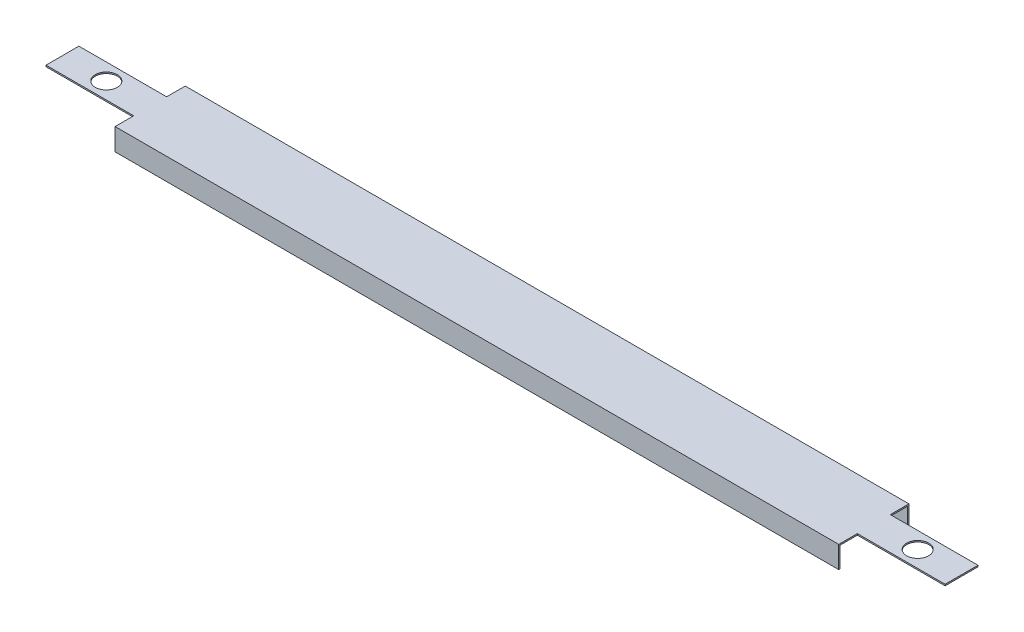
ISO-10303-21;
HEADER;
FILE_DESCRIPTION(('STEP AP214'),'2;1');
FILE_NAME('part.step','',(''),(''),'','','');
FILE_SCHEMA(('AUTOMOTIVE_DESIGN { 1 0 10303 214 1 1 1 1 }'));
ENDSEC;
DATA;
#1=APPLICATION_CONTEXT('core data for automotive mechanical design processes');
#2=APPLICATION_PROTOCOL_DEFINITION('international standard','automotive_design',2000,#1);
#3=PRODUCT_CONTEXT('',#1,'mechanical');
#4=PRODUCT('Part','Part','',(#3));
#5=PRODUCT_RELATED_PRODUCT_CATEGORY('part','',(#4));
#6=PRODUCT_DEFINITION_FORMATION('','',#4);
#7=PRODUCT_DEFINITION_CONTEXT('part definition',#1,'design');
#8=PRODUCT_DEFINITION('design','',#6,#7);
#9=PRODUCT_DEFINITION_SHAPE('','',#8);
#10=(LENGTH_UNIT() NAMED_UNIT(*) SI_UNIT(.MILLI.,.METRE.));
#11=(NAMED_UNIT(*) PLANE_ANGLE_UNIT() SI_UNIT($,.RADIAN.));
#12=(NAMED_UNIT(*) SI_UNIT($,.STERADIAN.) SOLID_ANGLE_UNIT());
#13=UNCERTAINTY_MEASURE_WITH_UNIT(LENGTH_MEASURE(1.E-05),#10,'distance_accuracy_value','');
#14=(GEOMETRIC_REPRESENTATION_CONTEXT(3) GLOBAL_UNCERTAINTY_ASSIGNED_CONTEXT((#13)) GLOBAL_UNIT_ASSIGNED_CONTEXT((#10,
#11,#12)) REPRESENTATION_CONTEXT('',''));
#15=CARTESIAN_POINT('',(0.,0.,0.));
#16=DIRECTION('',(0.,0.,1.));
#17=DIRECTION('',(1.,0.,0.));
#18=AXIS2_PLACEMENT_3D('',#15,#16,#17);
#19=CARTESIAN_POINT('',(0.,-6.35,0.));
#20=DIRECTION('',(0.,-1.,0.));
#21=DIRECTION('',(0.,0.,-1.));
#22=AXIS2_PLACEMENT_3D('',#19,#20,#21);
#23=PLANE('',#22);
#24=DIRECTION('',(0.,0.,1.));
#25=VECTOR('',#24,1.);
#26=CARTESIAN_POINT('',(104.775,-6.35,-10.16));
#27=LINE('',#26,#25);
#28=CARTESIAN_POINT('',(104.775,-6.35,-10.16));
#29=VERTEX_POINT('',#28);
#30=CARTESIAN_POINT('',(104.775,-6.35,-9.7536));
#31=VERTEX_POINT('',#30);
#32=EDGE_CURVE('E280',#29,#31,#27,.T.);
#33=ORIENTED_EDGE('',*,*,#32,.T.);
#34=DIRECTION('',(1.,0.,0.));
#35=VECTOR('',#34,1.);
#36=CARTESIAN_POINT('',(-130.175,-6.35,-9.7536));
#37=LINE('',#36,#35);
#38=CARTESIAN_POINT('',(-104.775,-6.35,-9.7536));
#39=VERTEX_POINT('',#38);
#40=EDGE_CURVE('E234',#39,#31,#37,.T.);
#41=ORIENTED_EDGE('',*,*,#40,.F.);
#42=DIRECTION('',(0.,0.,-1.));
#43=VECTOR('',#42,1.);
#44=CARTESIAN_POINT('',(-104.775,-6.35,-10.16));
#45=LINE('',#44,#43);
#46=CARTESIAN_POINT('',(-104.775,-6.35,-10.16));
#47=VERTEX_POINT('',#46);
#48=EDGE_CURVE('E48',#39,#47,#45,.T.);
#49=ORIENTED_EDGE('',*,*,#48,.T.);
#50=DIRECTION('',(-1.,0.,0.));
#51=VECTOR('',#50,1.);
#52=CARTESIAN_POINT('',(-130.175,-6.35,-10.16));
#53=LINE('',#52,#51);
#54=EDGE_CURVE('E174',#29,#47,#53,.T.);
#55=ORIENTED_EDGE('',*,*,#54,.F.);
#56=EDGE_LOOP('',(#33,#41,#49,#55));
#57=FACE_BOUND('',#56,.T.);
#58=ADVANCED_FACE('F33',(#57),#23,.T.);
#59=CARTESIAN_POINT('',(130.175,-6.35,10.16));
#60=DIRECTION('',(1.,0.,0.));
#61=DIRECTION('',(0.,0.,-1.));
#62=AXIS2_PLACEMENT_3D('',#59,#60,#61);
#63=PLANE('',#62);
#64=DIRECTION('',(0.,1.,0.));
#65=VECTOR('',#64,1.);
#66=CARTESIAN_POINT('',(130.175,-6.35,-4.7625));
#67=LINE('',#66,#65);
#68=CARTESIAN_POINT('',(130.175,-0.4064,-4.7625));
#69=VERTEX_POINT('',#68);
#70=CARTESIAN_POINT('',(130.175,0.,-4.7625));
#71=VERTEX_POINT('',#70);
#72=EDGE_CURVE('E224',#69,#71,#67,.T.);
#73=ORIENTED_EDGE('',*,*,#72,.T.);
#74=DIRECTION('',(0.,0.,-1.));
#75=VECTOR('',#74,1.);
#76=CARTESIAN_POINT('',(130.175,0.,10.16));
#77=LINE('',#76,#75);
#78=CARTESIAN_POINT('',(130.175,0.,4.7625));
#79=VERTEX_POINT('',#78);
#80=EDGE_CURVE('E183',#79,#71,#77,.T.);
#81=ORIENTED_EDGE('',*,*,#80,.F.);
#82=DIRECTION('',(0.,1.,0.));
#83=VECTOR('',#82,1.);
#84=CARTESIAN_POINT('',(130.175,-6.35,4.7625));
#85=LINE('',#84,#83);
#86=CARTESIAN_POINT('',(130.175,-0.4064,4.7625));
#87=VERTEX_POINT('',#86);
#88=EDGE_CURVE('E168',#87,#79,#85,.T.);
#89=ORIENTED_EDGE('',*,*,#88,.F.);
#90=DIRECTION('',(0.,0.,1.));
#91=VECTOR('',#90,1.);
#92=CARTESIAN_POINT('',(130.175,-0.4064,9.7536));
#93=LINE('',#92,#91);
#94=EDGE_CURVE('E217',#69,#87,#93,.T.);
#95=ORIENTED_EDGE('',*,*,#94,.F.);
#96=EDGE_LOOP('',(#73,#81,#89,#95));
#97=FACE_BOUND('',#96,.T.);
#98=ADVANCED_FACE('F35',(#97),#63,.T.);
#99=CARTESIAN_POINT('',(-130.175,-6.35,10.16));
#100=DIRECTION('',(0.,0.,1.));
#101=DIRECTION('',(1.,0.,0.));
#102=AXIS2_PLACEMENT_3D('',#99,#100,#101);
#103=PLANE('',#102);
#104=DIRECTION('',(0.,1.,0.));
#105=VECTOR('',#104,1.);
#106=CARTESIAN_POINT('',(-104.775,-6.35,10.16));
#107=LINE('',#106,#105);
#108=CARTESIAN_POINT('',(-104.775,-6.35,10.16));
#109=VERTEX_POINT('',#108);
#110=CARTESIAN_POINT('',(-104.775,0.,10.16));
#111=VERTEX_POINT('',#110);
#112=EDGE_CURVE('E172',#109,#111,#107,.T.);
#113=ORIENTED_EDGE('',*,*,#112,.F.);
#114=DIRECTION('',(1.,0.,0.));
#115=VECTOR('',#114,1.);
#116=CARTESIAN_POINT('',(-130.175,-6.35,10.16));
#117=LINE('',#116,#115);
#118=CARTESIAN_POINT('',(104.775,-6.35,10.16));
#119=VERTEX_POINT('',#118);
#120=EDGE_CURVE('E165',#109,#119,#117,.T.);
#121=ORIENTED_EDGE('',*,*,#120,.T.);
#122=DIRECTION('',(0.,1.,0.));
#123=VECTOR('',#122,1.);
#124=CARTESIAN_POINT('',(104.775,-6.35,10.16));
#125=LINE('',#124,#123);
#126=CARTESIAN_POINT('',(104.775,0.,10.16));
#127=VERTEX_POINT('',#126);
#128=EDGE_CURVE('E146',#119,#127,#125,.T.);
#129=ORIENTED_EDGE('',*,*,#128,.T.);
#130=DIRECTION('',(1.,0.,0.));
#131=VECTOR('',#130,1.);
#132=CARTESIAN_POINT('',(-130.175,0.,10.16));
#133=LINE('',#132,#131);
#134=EDGE_CURVE('E179',#111,#127,#133,.T.);
#135=ORIENTED_EDGE('',*,*,#134,.F.);
#136=EDGE_LOOP('',(#113,#121,#129,#135));
#137=FACE_BOUND('',#136,.T.);
#138=ADVANCED_FACE('F171',(#137),#103,.T.);
#139=CARTESIAN_POINT('',(-130.175,-6.35,10.16));
#140=DIRECTION('',(-1.,0.,0.));
#141=DIRECTION('',(0.,0.,1.));
#142=AXIS2_PLACEMENT_3D('',#139,#140,#141);
#143=PLANE('',#142);
#144=DIRECTION('',(0.,1.,0.));
#145=VECTOR('',#144,1.);
#146=CARTESIAN_POINT('',(-130.175,-6.35,4.7625));
#147=LINE('',#146,#145);
#148=CARTESIAN_POINT('',(-130.175,-0.4064,4.7625));
#149=VERTEX_POINT('',#148);
#150=CARTESIAN_POINT('',(-130.175,0.,4.7625));
#151=VERTEX_POINT('',#150);
#152=EDGE_CURVE('E268',#149,#151,#147,.T.);
#153=ORIENTED_EDGE('',*,*,#152,.T.);
#154=DIRECTION('',(0.,0.,1.));
#155=VECTOR('',#154,1.);
#156=CARTESIAN_POINT('',(-130.175,0.,10.16));
#157=LINE('',#156,#155);
#158=CARTESIAN_POINT('',(-130.175,0.,-4.7625));
#159=VERTEX_POINT('',#158);
#160=EDGE_CURVE('E190',#159,#151,#157,.T.);
#161=ORIENTED_EDGE('',*,*,#160,.F.);
#162=DIRECTION('',(0.,1.,0.));
#163=VECTOR('',#162,1.);
#164=CARTESIAN_POINT('',(-130.175,-6.35,-4.7625));
#165=LINE('',#164,#163);
#166=CARTESIAN_POINT('',(-130.175,-0.4064,-4.7625));
#167=VERTEX_POINT('',#166);
#168=EDGE_CURVE('E266',#167,#159,#165,.T.);
#169=ORIENTED_EDGE('',*,*,#168,.F.);
#170=DIRECTION('',(0.,0.,1.));
#171=VECTOR('',#170,1.);
#172=CARTESIAN_POINT('',(-130.175,-0.4064,9.7536));
#173=LINE('',#172,#171);
#174=EDGE_CURVE('E225',#167,#149,#173,.T.);
#175=ORIENTED_EDGE('',*,*,#174,.T.);
#176=EDGE_LOOP('',(#153,#161,#169,#175));
#177=FACE_BOUND('',#176,.T.);
#178=ADVANCED_FACE('F265',(#177),#143,.T.);
#179=CARTESIAN_POINT('',(-130.175,-6.35,-10.16));
#180=DIRECTION('',(0.,0.,-1.));
#181=DIRECTION('',(-1.,0.,0.));
#182=AXIS2_PLACEMENT_3D('',#179,#180,#181);
#183=PLANE('',#182);
#184=DIRECTION('',(0.,1.,0.));
#185=VECTOR('',#184,1.);
#186=CARTESIAN_POINT('',(104.775,-6.35,-10.16));
#187=LINE('',#186,#185);
#188=CARTESIAN_POINT('',(104.775,0.,-10.16));
#189=VERTEX_POINT('',#188);
#190=EDGE_CURVE('E283',#29,#189,#187,.T.);
#191=ORIENTED_EDGE('',*,*,#190,.F.);
#192=ORIENTED_EDGE('',*,*,#54,.T.);
#193=DIRECTION('',(0.,1.,0.));
#194=VECTOR('',#193,1.);
#195=CARTESIAN_POINT('',(-104.775,-6.35,-10.16));
#196=LINE('',#195,#194);
#197=CARTESIAN_POINT('',(-104.775,0.,-10.16));
#198=VERTEX_POINT('',#197);
#199=EDGE_CURVE('E295',#47,#198,#196,.T.);
#200=ORIENTED_EDGE('',*,*,#199,.T.);
#201=DIRECTION('',(-1.,0.,0.));
#202=VECTOR('',#201,1.);
#203=CARTESIAN_POINT('',(-130.175,0.,-10.16));
#204=LINE('',#203,#202);
#205=EDGE_CURVE('E186',#189,#198,#204,.T.);
#206=ORIENTED_EDGE('',*,*,#205,.F.);
#207=EDGE_LOOP('',(#191,#192,#200,#206));
#208=FACE_BOUND('',#207,.T.);
#209=ADVANCED_FACE('F317',(#208),#183,.T.);
#210=DIRECTION('',(0.,0.,-1.));
#211=VECTOR('',#210,1.);
#212=CARTESIAN_POINT('',(-104.775,-6.35,10.16));
#213=LINE('',#212,#211);
#214=CARTESIAN_POINT('',(-104.775,-6.35,9.7536));
#215=VERTEX_POINT('',#214);
#216=EDGE_CURVE('E279',#109,#215,#213,.T.);
#217=ORIENTED_EDGE('',*,*,#216,.T.);
#218=DIRECTION('',(1.,0.,0.));
#219=VECTOR('',#218,1.);
#220=CARTESIAN_POINT('',(-130.175,-6.35,9.7536));
#221=LINE('',#220,#219);
#222=CARTESIAN_POINT('',(104.775,-6.35,9.7536));
#223=VERTEX_POINT('',#222);
#224=EDGE_CURVE('E167',#215,#223,#221,.T.);
#225=ORIENTED_EDGE('',*,*,#224,.T.);
#226=DIRECTION('',(0.,0.,1.));
#227=VECTOR('',#226,1.);
#228=CARTESIAN_POINT('',(104.775,-6.35,10.16));
#229=LINE('',#228,#227);
#230=EDGE_CURVE('E149',#223,#119,#229,.T.);
#231=ORIENTED_EDGE('',*,*,#230,.T.);
#232=ORIENTED_EDGE('',*,*,#120,.F.);
#233=EDGE_LOOP('',(#217,#225,#231,#232));
#234=FACE_BOUND('',#233,.T.);
#235=ADVANCED_FACE('F164',(#234),#23,.T.);
#236=CARTESIAN_POINT('',(0.,0.,0.));
#237=DIRECTION('',(0.,-1.,0.));
#238=DIRECTION('',(0.,0.,-1.));
#239=AXIS2_PLACEMENT_3D('',#236,#237,#238);
#240=PLANE('',#239);
#241=CARTESIAN_POINT('',(117.475,0.,0.));
#242=DIRECTION('',(0.,1.,0.));
#243=DIRECTION('',(0.,0.,1.));
#244=AXIS2_PLACEMENT_3D('',#241,#242,#243);
#245=CIRCLE('',#244,3.1877);
#246=CARTESIAN_POINT('',(117.475,0.,3.18769999999997));
#247=VERTEX_POINT('',#246);
#248=EDGE_CURVE('E242',#247,#247,#245,.T.);
#249=ORIENTED_EDGE('',*,*,#248,.F.);
#250=EDGE_LOOP('',(#249));
#251=FACE_BOUND('',#250,.T.);
#252=CARTESIAN_POINT('',(-117.475,0.,0.));
#253=DIRECTION('',(0.,1.,0.));
#254=DIRECTION('',(0.,0.,1.));
#255=AXIS2_PLACEMENT_3D('',#252,#253,#254);
#256=CIRCLE('',#255,3.1877);
#257=CARTESIAN_POINT('',(-117.475,0.,3.1877));
#258=VERTEX_POINT('',#257);
#259=EDGE_CURVE('E187',#258,#258,#256,.T.);
#260=ORIENTED_EDGE('',*,*,#259,.F.);
#261=EDGE_LOOP('',(#260));
#262=FACE_BOUND('',#261,.T.);
#263=ORIENTED_EDGE('',*,*,#160,.T.);
#264=DIRECTION('',(-1.,0.,0.));
#265=VECTOR('',#264,1.);
#266=CARTESIAN_POINT('',(-130.175,0.,4.7625));
#267=LINE('',#266,#265);
#268=CARTESIAN_POINT('',(-104.775,0.,4.7625));
#269=VERTEX_POINT('',#268);
#270=EDGE_CURVE('E258',#269,#151,#267,.T.);
#271=ORIENTED_EDGE('',*,*,#270,.F.);
#272=DIRECTION('',(0.,0.,-1.));
#273=VECTOR('',#272,1.);
#274=CARTESIAN_POINT('',(-104.775,0.,10.16));
#275=LINE('',#274,#273);
#276=EDGE_CURVE('E289',#111,#269,#275,.T.);
#277=ORIENTED_EDGE('',*,*,#276,.F.);
#278=ORIENTED_EDGE('',*,*,#134,.T.);
#279=DIRECTION('',(0.,0.,1.));
#280=VECTOR('',#279,1.);
#281=CARTESIAN_POINT('',(104.775,0.,10.16));
#282=LINE('',#281,#280);
#283=CARTESIAN_POINT('',(104.775,0.,4.7625));
#284=VERTEX_POINT('',#283);
#285=EDGE_CURVE('E152',#284,#127,#282,.T.);
#286=ORIENTED_EDGE('',*,*,#285,.F.);
#287=DIRECTION('',(-1.,0.,0.));
#288=VECTOR('',#287,1.);
#289=CARTESIAN_POINT('',(130.175,0.,4.7625));
#290=LINE('',#289,#288);
#291=EDGE_CURVE('E501',#79,#284,#290,.T.);
#292=ORIENTED_EDGE('',*,*,#291,.F.);
#293=ORIENTED_EDGE('',*,*,#80,.T.);
#294=DIRECTION('',(1.,0.,0.));
#295=VECTOR('',#294,1.);
#296=CARTESIAN_POINT('',(130.175,0.,-4.7625));
#297=LINE('',#296,#295);
#298=CARTESIAN_POINT('',(104.775,0.,-4.7625));
#299=VERTEX_POINT('',#298);
#300=EDGE_CURVE('E284',#299,#71,#297,.T.);
#301=ORIENTED_EDGE('',*,*,#300,.F.);
#302=DIRECTION('',(0.,0.,1.));
#303=VECTOR('',#302,1.);
#304=CARTESIAN_POINT('',(104.775,0.,-10.16));
#305=LINE('',#304,#303);
#306=EDGE_CURVE('E157',#189,#299,#305,.T.);
#307=ORIENTED_EDGE('',*,*,#306,.F.);
#308=ORIENTED_EDGE('',*,*,#205,.T.);
#309=DIRECTION('',(0.,0.,-1.));
#310=VECTOR('',#309,1.);
#311=CARTESIAN_POINT('',(-104.775,0.,-10.16));
#312=LINE('',#311,#310);
#313=CARTESIAN_POINT('',(-104.775,0.,-4.7625));
#314=VERTEX_POINT('',#313);
#315=EDGE_CURVE('E272',#314,#198,#312,.T.);
#316=ORIENTED_EDGE('',*,*,#315,.F.);
#317=DIRECTION('',(1.,0.,0.));
#318=VECTOR('',#317,1.);
#319=CARTESIAN_POINT('',(-130.175,0.,-4.7625));
#320=LINE('',#319,#318);
#321=EDGE_CURVE('E261',#159,#314,#320,.T.);
#322=ORIENTED_EDGE('',*,*,#321,.F.);
#323=EDGE_LOOP('',(#263,#271,#277,#278,#286,#292,#293,#301,#307,#308,#316,#322));
#324=FACE_BOUND('',#323,.T.);
#325=ADVANCED_FACE('F249',(#251,#262,#324),#240,.F.);
#326=CARTESIAN_POINT('',(-117.475,-6.35,0.));
#327=DIRECTION('',(0.,1.,0.));
#328=DIRECTION('',(0.,0.,1.));
#329=AXIS2_PLACEMENT_3D('',#326,#327,#328);
#330=CYLINDRICAL_SURFACE('',#329,3.1877);
#331=CARTESIAN_POINT('',(-117.475,-0.4064,0.));
#332=DIRECTION('',(0.,1.,0.));
#333=DIRECTION('',(0.,0.,1.));
#334=AXIS2_PLACEMENT_3D('',#331,#332,#333);
#335=CIRCLE('',#334,3.1877);
#336=CARTESIAN_POINT('',(-117.475,-0.4064,3.1877));
#337=VERTEX_POINT('',#336);
#338=EDGE_CURVE('E196',#337,#337,#335,.F.);
#339=ORIENTED_EDGE('',*,*,#338,.T.);
#340=EDGE_LOOP('',(#339));
#341=FACE_BOUND('',#340,.T.);
#342=ORIENTED_EDGE('',*,*,#259,.T.);
#343=EDGE_LOOP('',(#342));
#344=FACE_BOUND('',#343,.T.);
#345=ADVANCED_FACE('F247',(#341,#344),#330,.F.);
#346=CARTESIAN_POINT('',(117.475,-6.35,0.));
#347=DIRECTION('',(0.,1.,0.));
#348=DIRECTION('',(0.,0.,1.));
#349=AXIS2_PLACEMENT_3D('',#346,#347,#348);
#350=CYLINDRICAL_SURFACE('',#349,3.1877);
#351=CARTESIAN_POINT('',(117.475,-0.4064,0.));
#352=DIRECTION('',(0.,1.,0.));
#353=DIRECTION('',(0.,0.,1.));
#354=AXIS2_PLACEMENT_3D('',#351,#352,#353);
#355=CIRCLE('',#354,3.1877);
#356=CARTESIAN_POINT('',(117.475,-0.4064,3.18769999999997));
#357=VERTEX_POINT('',#356);
#358=EDGE_CURVE('E194',#357,#357,#355,.F.);
#359=ORIENTED_EDGE('',*,*,#358,.T.);
#360=EDGE_LOOP('',(#359));
#361=FACE_BOUND('',#360,.T.);
#362=ORIENTED_EDGE('',*,*,#248,.T.);
#363=EDGE_LOOP('',(#362));
#364=FACE_BOUND('',#363,.T.);
#365=ADVANCED_FACE('F383',(#361,#364),#350,.F.);
#366=CARTESIAN_POINT('',(-130.175,-0.4064,9.7536));
#367=DIRECTION('',(0.,1.,0.));
#368=DIRECTION('',(0.,0.,1.));
#369=AXIS2_PLACEMENT_3D('',#366,#367,#368);
#370=PLANE('',#369);
#371=ORIENTED_EDGE('',*,*,#358,.F.);
#372=EDGE_LOOP('',(#371));
#373=FACE_BOUND('',#372,.T.);
#374=DIRECTION('',(0.,0.,-1.));
#375=VECTOR('',#374,1.);
#376=CARTESIAN_POINT('',(-104.775,-0.4064,9.7536));
#377=LINE('',#376,#375);
#378=CARTESIAN_POINT('',(-104.775,-0.4064,9.7536));
#379=VERTEX_POINT('',#378);
#380=CARTESIAN_POINT('',(-104.775,-0.4064,4.7625));
#381=VERTEX_POINT('',#380);
#382=EDGE_CURVE('E304',#379,#381,#377,.T.);
#383=ORIENTED_EDGE('',*,*,#382,.T.);
#384=DIRECTION('',(-1.,0.,0.));
#385=VECTOR('',#384,1.);
#386=CARTESIAN_POINT('',(-130.175,-0.4064,4.7625));
#387=LINE('',#386,#385);
#388=EDGE_CURVE('E11',#381,#149,#387,.T.);
#389=ORIENTED_EDGE('',*,*,#388,.T.);
#390=ORIENTED_EDGE('',*,*,#174,.F.);
#391=DIRECTION('',(1.,0.,0.));
#392=VECTOR('',#391,1.);
#393=CARTESIAN_POINT('',(-130.175,-0.4064,-4.7625));
#394=LINE('',#393,#392);
#395=CARTESIAN_POINT('',(-104.775,-0.4064,-4.7625));
#396=VERTEX_POINT('',#395);
#397=EDGE_CURVE('E205',#167,#396,#394,.T.);
#398=ORIENTED_EDGE('',*,*,#397,.T.);
#399=DIRECTION('',(0.,0.,-1.));
#400=VECTOR('',#399,1.);
#401=CARTESIAN_POINT('',(-104.775,-0.4064,9.7536));
#402=LINE('',#401,#400);
#403=CARTESIAN_POINT('',(-104.775,-0.4064,-9.7536));
#404=VERTEX_POINT('',#403);
#405=EDGE_CURVE('E230',#396,#404,#402,.T.);
#406=ORIENTED_EDGE('',*,*,#405,.T.);
#407=DIRECTION('',(1.,0.,0.));
#408=VECTOR('',#407,1.);
#409=CARTESIAN_POINT('',(-130.175,-0.4064,-9.7536));
#410=LINE('',#409,#408);
#411=CARTESIAN_POINT('',(104.775,-0.4064,-9.7536));
#412=VERTEX_POINT('',#411);
#413=EDGE_CURVE('E197',#404,#412,#410,.T.);
#414=ORIENTED_EDGE('',*,*,#413,.T.);
#415=DIRECTION('',(0.,0.,1.));
#416=VECTOR('',#415,1.);
#417=CARTESIAN_POINT('',(104.775,-0.4064,9.7536));
#418=LINE('',#417,#416);
#419=CARTESIAN_POINT('',(104.775,-0.4064,-4.7625));
#420=VERTEX_POINT('',#419);
#421=EDGE_CURVE('E56',#412,#420,#418,.T.);
#422=ORIENTED_EDGE('',*,*,#421,.T.);
#423=DIRECTION('',(1.,0.,0.));
#424=VECTOR('',#423,1.);
#425=CARTESIAN_POINT('',(-130.175,-0.4064,-4.76249999999999));
#426=LINE('',#425,#424);
#427=EDGE_CURVE('E41',#420,#69,#426,.T.);
#428=ORIENTED_EDGE('',*,*,#427,.T.);
#429=ORIENTED_EDGE('',*,*,#94,.T.);
#430=DIRECTION('',(-1.,0.,0.));
#431=VECTOR('',#430,1.);
#432=CARTESIAN_POINT('',(-130.175,-0.4064,4.76250000000001));
#433=LINE('',#432,#431);
#434=CARTESIAN_POINT('',(104.775,-0.4064,4.7625));
#435=VERTEX_POINT('',#434);
#436=EDGE_CURVE('E208',#87,#435,#433,.T.);
#437=ORIENTED_EDGE('',*,*,#436,.T.);
#438=DIRECTION('',(0.,0.,1.));
#439=VECTOR('',#438,1.);
#440=CARTESIAN_POINT('',(104.775,-0.4064,9.7536));
#441=LINE('',#440,#439);
#442=CARTESIAN_POINT('',(104.775,-0.406399999999999,9.7536));
#443=VERTEX_POINT('',#442);
#444=EDGE_CURVE('E298',#435,#443,#441,.T.);
#445=ORIENTED_EDGE('',*,*,#444,.T.);
#446=DIRECTION('',(1.,0.,0.));
#447=VECTOR('',#446,1.);
#448=CARTESIAN_POINT('',(-130.175,-0.4064,9.7536));
#449=LINE('',#448,#447);
#450=EDGE_CURVE('E228',#379,#443,#449,.T.);
#451=ORIENTED_EDGE('',*,*,#450,.F.);
#452=EDGE_LOOP('',(#383,#389,#390,#398,#406,#414,#422,#428,#429,#437,#445,#451));
#453=FACE_BOUND('',#452,.T.);
#454=ORIENTED_EDGE('',*,*,#338,.F.);
#455=EDGE_LOOP('',(#454));
#456=FACE_BOUND('',#455,.T.);
#457=ADVANCED_FACE('F215',(#373,#453,#456),#370,.F.);
#458=CARTESIAN_POINT('',(-130.175,-0.4064,-9.7536));
#459=DIRECTION('',(0.,0.,-1.));
#460=DIRECTION('',(-1.,0.,0.));
#461=AXIS2_PLACEMENT_3D('',#458,#459,#460);
#462=PLANE('',#461);
#463=ORIENTED_EDGE('',*,*,#40,.T.);
#464=DIRECTION('',(0.,1.,0.));
#465=VECTOR('',#464,1.);
#466=CARTESIAN_POINT('',(104.775,-0.4064,-9.7536));
#467=LINE('',#466,#465);
#468=EDGE_CURVE('E203',#31,#412,#467,.T.);
#469=ORIENTED_EDGE('',*,*,#468,.T.);
#470=ORIENTED_EDGE('',*,*,#413,.F.);
#471=DIRECTION('',(0.,-1.,0.));
#472=VECTOR('',#471,1.);
#473=CARTESIAN_POINT('',(-104.775,-0.4064,-9.7536));
#474=LINE('',#473,#472);
#475=EDGE_CURVE('E201',#404,#39,#474,.T.);
#476=ORIENTED_EDGE('',*,*,#475,.T.);
#477=EDGE_LOOP('',(#463,#469,#470,#476));
#478=FACE_BOUND('',#477,.T.);
#479=ADVANCED_FACE('F310',(#478),#462,.F.);
#480=CARTESIAN_POINT('',(-130.175,-6.35,9.7536));
#481=DIRECTION('',(0.,0.,1.));
#482=DIRECTION('',(1.,0.,0.));
#483=AXIS2_PLACEMENT_3D('',#480,#481,#482);
#484=PLANE('',#483);
#485=ORIENTED_EDGE('',*,*,#224,.F.);
#486=DIRECTION('',(0.,1.,0.));
#487=VECTOR('',#486,1.);
#488=CARTESIAN_POINT('',(-104.775,-6.35,9.7536));
#489=LINE('',#488,#487);
#490=EDGE_CURVE('E176',#215,#379,#489,.T.);
#491=ORIENTED_EDGE('',*,*,#490,.T.);
#492=ORIENTED_EDGE('',*,*,#450,.T.);
#493=DIRECTION('',(0.,-1.,0.));
#494=VECTOR('',#493,1.);
#495=CARTESIAN_POINT('',(104.775,-6.35,9.7536));
#496=LINE('',#495,#494);
#497=EDGE_CURVE('E173',#443,#223,#496,.T.);
#498=ORIENTED_EDGE('',*,*,#497,.T.);
#499=EDGE_LOOP('',(#485,#491,#492,#498));
#500=FACE_BOUND('',#499,.T.);
#501=ADVANCED_FACE('F395',(#500),#484,.F.);
#502=CARTESIAN_POINT('',(130.175,-6.35,4.7625));
#503=DIRECTION('',(0.,0.,-1.));
#504=DIRECTION('',(-1.,0.,0.));
#505=AXIS2_PLACEMENT_3D('',#502,#503,#504);
#506=PLANE('',#505);
#507=ORIENTED_EDGE('',*,*,#88,.T.);
#508=ORIENTED_EDGE('',*,*,#291,.T.);
#509=DIRECTION('',(0.,1.,0.));
#510=VECTOR('',#509,1.);
#511=CARTESIAN_POINT('',(104.775,-6.35,4.7625));
#512=LINE('',#511,#510);
#513=EDGE_CURVE('E158',#435,#284,#512,.T.);
#514=ORIENTED_EDGE('',*,*,#513,.F.);
#515=ORIENTED_EDGE('',*,*,#436,.F.);
#516=EDGE_LOOP('',(#507,#508,#514,#515));
#517=FACE_BOUND('',#516,.T.);
#518=ADVANCED_FACE('F404',(#517),#506,.F.);
#519=CARTESIAN_POINT('',(104.775,-6.35,10.16));
#520=DIRECTION('',(-1.,0.,0.));
#521=DIRECTION('',(0.,0.,1.));
#522=AXIS2_PLACEMENT_3D('',#519,#520,#521);
#523=PLANE('',#522);
#524=ORIENTED_EDGE('',*,*,#513,.T.);
#525=ORIENTED_EDGE('',*,*,#285,.T.);
#526=ORIENTED_EDGE('',*,*,#128,.F.);
#527=ORIENTED_EDGE('',*,*,#230,.F.);
#528=ORIENTED_EDGE('',*,*,#497,.F.);
#529=ORIENTED_EDGE('',*,*,#444,.F.);
#530=EDGE_LOOP('',(#524,#525,#526,#527,#528,#529));
#531=FACE_BOUND('',#530,.T.);
#532=ADVANCED_FACE('F148',(#531),#523,.F.);
#533=CARTESIAN_POINT('',(-130.175,-6.35,4.7625));
#534=DIRECTION('',(0.,0.,-1.));
#535=DIRECTION('',(-1.,0.,0.));
#536=AXIS2_PLACEMENT_3D('',#533,#534,#535);
#537=PLANE('',#536);
#538=DIRECTION('',(0.,1.,0.));
#539=VECTOR('',#538,1.);
#540=CARTESIAN_POINT('',(-104.775,-6.35,4.7625));
#541=LINE('',#540,#539);
#542=EDGE_CURVE('E270',#381,#269,#541,.T.);
#543=ORIENTED_EDGE('',*,*,#542,.T.);
#544=ORIENTED_EDGE('',*,*,#270,.T.);
#545=ORIENTED_EDGE('',*,*,#152,.F.);
#546=ORIENTED_EDGE('',*,*,#388,.F.);
#547=EDGE_LOOP('',(#543,#544,#545,#546));
#548=FACE_BOUND('',#547,.T.);
#549=ADVANCED_FACE('F423',(#548),#537,.F.);
#550=CARTESIAN_POINT('',(-104.775,-6.35,10.16));
#551=DIRECTION('',(1.,0.,0.));
#552=DIRECTION('',(0.,0.,-1.));
#553=AXIS2_PLACEMENT_3D('',#550,#551,#552);
#554=PLANE('',#553);
#555=ORIENTED_EDGE('',*,*,#490,.F.);
#556=ORIENTED_EDGE('',*,*,#216,.F.);
#557=ORIENTED_EDGE('',*,*,#112,.T.);
#558=ORIENTED_EDGE('',*,*,#276,.T.);
#559=ORIENTED_EDGE('',*,*,#542,.F.);
#560=ORIENTED_EDGE('',*,*,#382,.F.);
#561=EDGE_LOOP('',(#555,#556,#557,#558,#559,#560));
#562=FACE_BOUND('',#561,.T.);
#563=ADVANCED_FACE('F432',(#562),#554,.F.);
#564=CARTESIAN_POINT('',(-130.175,-6.35,-4.7625));
#565=DIRECTION('',(0.,0.,1.));
#566=DIRECTION('',(1.,0.,0.));
#567=AXIS2_PLACEMENT_3D('',#564,#565,#566);
#568=PLANE('',#567);
#569=ORIENTED_EDGE('',*,*,#168,.T.);
#570=ORIENTED_EDGE('',*,*,#321,.T.);
#571=DIRECTION('',(0.,1.,0.));
#572=VECTOR('',#571,1.);
#573=CARTESIAN_POINT('',(-104.775,-6.35,-4.7625));
#574=LINE('',#573,#572);
#575=EDGE_CURVE('E299',#396,#314,#574,.T.);
#576=ORIENTED_EDGE('',*,*,#575,.F.);
#577=ORIENTED_EDGE('',*,*,#397,.F.);
#578=EDGE_LOOP('',(#569,#570,#576,#577));
#579=FACE_BOUND('',#578,.T.);
#580=ADVANCED_FACE('F331',(#579),#568,.F.);
#581=CARTESIAN_POINT('',(-104.775,-6.35,-10.16));
#582=DIRECTION('',(1.,0.,0.));
#583=DIRECTION('',(0.,0.,-1.));
#584=AXIS2_PLACEMENT_3D('',#581,#582,#583);
#585=PLANE('',#584);
#586=ORIENTED_EDGE('',*,*,#575,.T.);
#587=ORIENTED_EDGE('',*,*,#315,.T.);
#588=ORIENTED_EDGE('',*,*,#199,.F.);
#589=ORIENTED_EDGE('',*,*,#48,.F.);
#590=ORIENTED_EDGE('',*,*,#475,.F.);
#591=ORIENTED_EDGE('',*,*,#405,.F.);
#592=EDGE_LOOP('',(#586,#587,#588,#589,#590,#591));
#593=FACE_BOUND('',#592,.T.);
#594=ADVANCED_FACE('F324',(#593),#585,.F.);
#595=CARTESIAN_POINT('',(130.175,-6.35,-4.7625));
#596=DIRECTION('',(0.,0.,1.));
#597=DIRECTION('',(1.,0.,0.));
#598=AXIS2_PLACEMENT_3D('',#595,#596,#597);
#599=PLANE('',#598);
#600=DIRECTION('',(0.,1.,0.));
#601=VECTOR('',#600,1.);
#602=CARTESIAN_POINT('',(104.775,-6.35,-4.7625));
#603=LINE('',#602,#601);
#604=EDGE_CURVE('E290',#420,#299,#603,.T.);
#605=ORIENTED_EDGE('',*,*,#604,.T.);
#606=ORIENTED_EDGE('',*,*,#300,.T.);
#607=ORIENTED_EDGE('',*,*,#72,.F.);
#608=ORIENTED_EDGE('',*,*,#427,.F.);
#609=EDGE_LOOP('',(#605,#606,#607,#608));
#610=FACE_BOUND('',#609,.T.);
#611=ADVANCED_FACE('F322',(#610),#599,.F.);
#612=CARTESIAN_POINT('',(104.775,-6.35,-10.16));
#613=DIRECTION('',(-1.,0.,0.));
#614=DIRECTION('',(0.,0.,1.));
#615=AXIS2_PLACEMENT_3D('',#612,#613,#614);
#616=PLANE('',#615);
#617=ORIENTED_EDGE('',*,*,#468,.F.);
#618=ORIENTED_EDGE('',*,*,#32,.F.);
#619=ORIENTED_EDGE('',*,*,#190,.T.);
#620=ORIENTED_EDGE('',*,*,#306,.T.);
#621=ORIENTED_EDGE('',*,*,#604,.F.);
#622=ORIENTED_EDGE('',*,*,#421,.F.);
#623=EDGE_LOOP('',(#617,#618,#619,#620,#621,#622));
#624=FACE_BOUND('',#623,.T.);
#625=ADVANCED_FACE('F312',(#624),#616,.F.);
#626=CLOSED_SHELL('',(#58,#98,#138,#178,#209,#235,#325,#345,#365,#457,#479,#501,#518,#532,#549,
#563,#580,#594,#611,#625));
#627=MANIFOLD_SOLID_BREP('B2',#626);
#628=ADVANCED_BREP_SHAPE_REPRESENTATION('',(#18,#627),#14);
#629=SHAPE_DEFINITION_REPRESENTATION(#9,#628);
ENDSEC;
END-ISO-10303-21;
